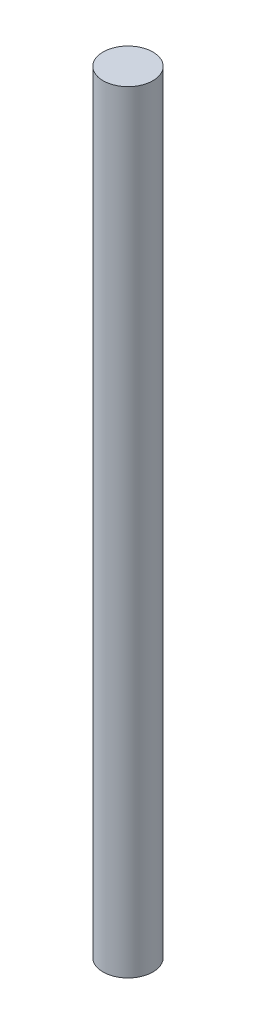
ISO-10303-21;
HEADER;
FILE_DESCRIPTION(('STEP AP214'),'2;1');
FILE_NAME('part.step','',(''),(''),'','','');
FILE_SCHEMA(('AUTOMOTIVE_DESIGN { 1 0 10303 214 1 1 1 1 }'));
ENDSEC;
DATA;
#1=APPLICATION_CONTEXT('core data for automotive mechanical design processes');
#2=APPLICATION_PROTOCOL_DEFINITION('international standard','automotive_design',2000,#1);
#3=PRODUCT_CONTEXT('',#1,'mechanical');
#4=PRODUCT('Part','Part','',(#3));
#5=PRODUCT_RELATED_PRODUCT_CATEGORY('part','',(#4));
#6=PRODUCT_DEFINITION_FORMATION('','',#4);
#7=PRODUCT_DEFINITION_CONTEXT('part definition',#1,'design');
#8=PRODUCT_DEFINITION('design','',#6,#7);
#9=PRODUCT_DEFINITION_SHAPE('','',#8);
#10=(LENGTH_UNIT() NAMED_UNIT(*) SI_UNIT(.MILLI.,.METRE.));
#11=(NAMED_UNIT(*) PLANE_ANGLE_UNIT() SI_UNIT($,.RADIAN.));
#12=(NAMED_UNIT(*) SI_UNIT($,.STERADIAN.) SOLID_ANGLE_UNIT());
#13=UNCERTAINTY_MEASURE_WITH_UNIT(LENGTH_MEASURE(1.E-05),#10,'distance_accuracy_value','');
#14=(GEOMETRIC_REPRESENTATION_CONTEXT(3) GLOBAL_UNCERTAINTY_ASSIGNED_CONTEXT((#13)) GLOBAL_UNIT_ASSIGNED_CONTEXT((#10,
#11,#12)) REPRESENTATION_CONTEXT('',''));
#15=CARTESIAN_POINT('',(0.,0.,0.));
#16=DIRECTION('',(0.,0.,1.));
#17=DIRECTION('',(1.,0.,0.));
#18=AXIS2_PLACEMENT_3D('',#15,#16,#17);
#19=CARTESIAN_POINT('',(0.,62.,0.));
#20=DIRECTION('',(0.,-1.,0.));
#21=DIRECTION('',(0.,0.,-1.));
#22=AXIS2_PLACEMENT_3D('',#19,#20,#21);
#23=CYLINDRICAL_SURFACE('',#22,2.);
#24=CARTESIAN_POINT('',(0.,62.,0.));
#25=DIRECTION('',(0.,1.,0.));
#26=DIRECTION('',(0.,0.,1.));
#27=AXIS2_PLACEMENT_3D('',#24,#25,#26);
#28=CIRCLE('',#27,2.);
#29=CARTESIAN_POINT('',(0.,62.,2.));
#30=VERTEX_POINT('',#29);
#31=EDGE_CURVE('E10',#30,#30,#28,.T.);
#32=ORIENTED_EDGE('',*,*,#31,.F.);
#33=EDGE_LOOP('',(#32));
#34=FACE_BOUND('',#33,.T.);
#35=CARTESIAN_POINT('',(0.,0.,0.));
#36=DIRECTION('',(0.,1.,0.));
#37=DIRECTION('',(0.,0.,1.));
#38=AXIS2_PLACEMENT_3D('',#35,#36,#37);
#39=CIRCLE('',#38,2.);
#40=CARTESIAN_POINT('',(0.,0.,2.));
#41=VERTEX_POINT('',#40);
#42=EDGE_CURVE('E33',#41,#41,#39,.T.);
#43=ORIENTED_EDGE('',*,*,#42,.T.);
#44=EDGE_LOOP('',(#43));
#45=FACE_BOUND('',#44,.T.);
#46=ADVANCED_FACE('F30',(#34,#45),#23,.T.);
#47=CARTESIAN_POINT('',(0.,62.,0.));
#48=DIRECTION('',(0.,1.,0.));
#49=DIRECTION('',(0.,0.,1.));
#50=AXIS2_PLACEMENT_3D('',#47,#48,#49);
#51=PLANE('',#50);
#52=ORIENTED_EDGE('',*,*,#31,.T.);
#53=EDGE_LOOP('',(#52));
#54=FACE_BOUND('',#53,.T.);
#55=ADVANCED_FACE('F45',(#54),#51,.T.);
#56=CARTESIAN_POINT('',(0.,0.,0.));
#57=DIRECTION('',(0.,1.,0.));
#58=DIRECTION('',(0.,0.,1.));
#59=AXIS2_PLACEMENT_3D('',#56,#57,#58);
#60=PLANE('',#59);
#61=ORIENTED_EDGE('',*,*,#42,.F.);
#62=EDGE_LOOP('',(#61));
#63=FACE_BOUND('',#62,.T.);
#64=ADVANCED_FACE('F43',(#63),#60,.F.);
#65=CLOSED_SHELL('',(#46,#55,#64));
#66=MANIFOLD_SOLID_BREP('B2',#65);
#67=ADVANCED_BREP_SHAPE_REPRESENTATION('',(#18,#66),#14);
#68=SHAPE_DEFINITION_REPRESENTATION(#9,#67);
ENDSEC;
END-ISO-10303-21;
